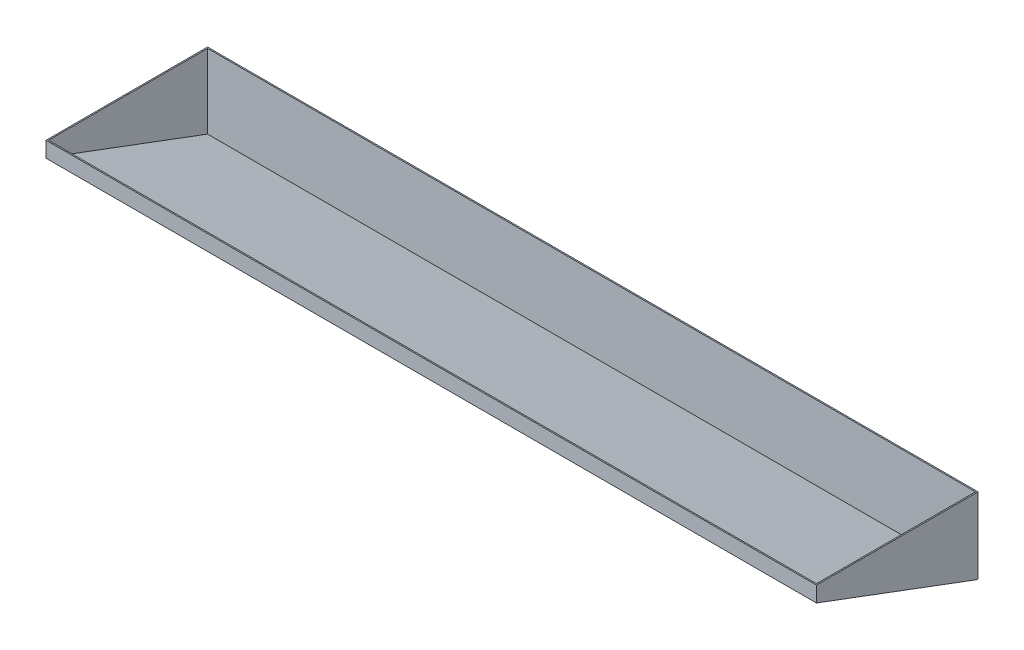
ISO-10303-21;
HEADER;
FILE_DESCRIPTION(('STEP AP214'),'2;1');
FILE_NAME('part.step','',(''),(''),'','','');
FILE_SCHEMA(('AUTOMOTIVE_DESIGN { 1 0 10303 214 1 1 1 1 }'));
ENDSEC;
DATA;
#1=APPLICATION_CONTEXT('core data for automotive mechanical design processes');
#2=APPLICATION_PROTOCOL_DEFINITION('international standard','automotive_design',2000,#1);
#3=PRODUCT_CONTEXT('',#1,'mechanical');
#4=PRODUCT('Part','Part','',(#3));
#5=PRODUCT_RELATED_PRODUCT_CATEGORY('part','',(#4));
#6=PRODUCT_DEFINITION_FORMATION('','',#4);
#7=PRODUCT_DEFINITION_CONTEXT('part definition',#1,'design');
#8=PRODUCT_DEFINITION('design','',#6,#7);
#9=PRODUCT_DEFINITION_SHAPE('','',#8);
#10=(LENGTH_UNIT() NAMED_UNIT(*) SI_UNIT(.MILLI.,.METRE.));
#11=(NAMED_UNIT(*) PLANE_ANGLE_UNIT() SI_UNIT($,.RADIAN.));
#12=(NAMED_UNIT(*) SI_UNIT($,.STERADIAN.) SOLID_ANGLE_UNIT());
#13=UNCERTAINTY_MEASURE_WITH_UNIT(LENGTH_MEASURE(1.E-05),#10,'distance_accuracy_value','');
#14=(GEOMETRIC_REPRESENTATION_CONTEXT(3) GLOBAL_UNCERTAINTY_ASSIGNED_CONTEXT((#13)) GLOBAL_UNIT_ASSIGNED_CONTEXT((#10,
#11,#12)) REPRESENTATION_CONTEXT('',''));
#15=CARTESIAN_POINT('',(0.,0.,0.));
#16=DIRECTION('',(0.,0.,1.));
#17=DIRECTION('',(1.,0.,0.));
#18=AXIS2_PLACEMENT_3D('',#15,#16,#17);
#19=CARTESIAN_POINT('',(0.,50.,0.8));
#20=DIRECTION('',(0.,-1.,0.));
#21=DIRECTION('',(0.,0.,-1.));
#22=AXIS2_PLACEMENT_3D('',#19,#20,#21);
#23=PLANE('',#22);
#24=DIRECTION('',(-1.,0.,0.));
#25=VECTOR('',#24,1.);
#26=CARTESIAN_POINT('',(0.,50.,0.));
#27=LINE('',#26,#25);
#28=CARTESIAN_POINT('',(510.,50.,0.));
#29=VERTEX_POINT('',#28);
#30=CARTESIAN_POINT('',(0.,50.,0.));
#31=VERTEX_POINT('',#30);
#32=EDGE_CURVE('E77',#29,#31,#27,.T.);
#33=ORIENTED_EDGE('',*,*,#32,.T.);
#34=DIRECTION('',(0.,0.,-1.));
#35=VECTOR('',#34,1.);
#36=CARTESIAN_POINT('',(0.,50.,0.8));
#37=LINE('',#36,#35);
#38=CARTESIAN_POINT('',(0.,50.,106.948846412905));
#39=VERTEX_POINT('',#38);
#40=EDGE_CURVE('E82',#39,#31,#37,.T.);
#41=ORIENTED_EDGE('',*,*,#40,.F.);
#42=DIRECTION('',(-1.,0.,0.));
#43=VECTOR('',#42,1.);
#44=CARTESIAN_POINT('',(510.,50.,106.948846412905));
#45=LINE('',#44,#43);
#46=CARTESIAN_POINT('',(510.,50.,106.948846412905));
#47=VERTEX_POINT('',#46);
#48=EDGE_CURVE('E103',#47,#39,#45,.T.);
#49=ORIENTED_EDGE('',*,*,#48,.F.);
#50=DIRECTION('',(0.,0.,-1.));
#51=VECTOR('',#50,1.);
#52=CARTESIAN_POINT('',(510.,50.,0.8));
#53=LINE('',#52,#51);
#54=EDGE_CURVE('E85',#47,#29,#53,.T.);
#55=ORIENTED_EDGE('',*,*,#54,.T.);
#56=EDGE_LOOP('',(#33,#41,#49,#55));
#57=FACE_BOUND('',#56,.T.);
#58=DIRECTION('',(-1.,0.,0.));
#59=VECTOR('',#58,1.);
#60=CARTESIAN_POINT('',(0.,50.,0.8));
#61=LINE('',#60,#59);
#62=CARTESIAN_POINT('',(509.2,50.,0.8));
#63=VERTEX_POINT('',#62);
#64=CARTESIAN_POINT('',(0.8,50.,0.8));
#65=VERTEX_POINT('',#64);
#66=EDGE_CURVE('E201',#63,#65,#61,.T.);
#67=ORIENTED_EDGE('',*,*,#66,.F.);
#68=DIRECTION('',(0.,0.,-1.));
#69=VECTOR('',#68,1.);
#70=CARTESIAN_POINT('',(509.2,50.,0.8));
#71=LINE('',#70,#69);
#72=CARTESIAN_POINT('',(509.2,50.,106.148846412905));
#73=VERTEX_POINT('',#72);
#74=EDGE_CURVE('E202',#73,#63,#71,.T.);
#75=ORIENTED_EDGE('',*,*,#74,.F.);
#76=DIRECTION('',(-1.,0.,0.));
#77=VECTOR('',#76,1.);
#78=CARTESIAN_POINT('',(0.,50.,106.148846412905));
#79=LINE('',#78,#77);
#80=CARTESIAN_POINT('',(0.8,50.,106.148846412905));
#81=VERTEX_POINT('',#80);
#82=EDGE_CURVE('E196',#73,#81,#79,.T.);
#83=ORIENTED_EDGE('',*,*,#82,.T.);
#84=DIRECTION('',(0.,0.,-1.));
#85=VECTOR('',#84,1.);
#86=CARTESIAN_POINT('',(0.8,50.,0.8));
#87=LINE('',#86,#85);
#88=EDGE_CURVE('E186',#81,#65,#87,.T.);
#89=ORIENTED_EDGE('',*,*,#88,.T.);
#90=EDGE_LOOP('',(#67,#75,#83,#89));
#91=FACE_BOUND('',#90,.T.);
#92=ADVANCED_FACE('F35',(#57,#91),#23,.F.);
#93=CARTESIAN_POINT('',(0.,0.,0.8));
#94=DIRECTION('',(1.,0.,0.));
#95=DIRECTION('',(0.,0.,-1.));
#96=AXIS2_PLACEMENT_3D('',#93,#94,#95);
#97=PLANE('',#96);
#98=DIRECTION('',(0.,-1.,0.));
#99=VECTOR('',#98,1.);
#100=CARTESIAN_POINT('',(0.,0.,0.));
#101=LINE('',#100,#99);
#102=CARTESIAN_POINT('',(0.,0.,0.));
#103=VERTEX_POINT('',#102);
#104=EDGE_CURVE('E96',#31,#103,#101,.T.);
#105=ORIENTED_EDGE('',*,*,#104,.T.);
#106=DIRECTION('',(0.,0.,-1.));
#107=VECTOR('',#106,1.);
#108=CARTESIAN_POINT('',(0.,0.,0.8));
#109=LINE('',#108,#107);
#110=CARTESIAN_POINT('',(0.,0.,0.8));
#111=VERTEX_POINT('',#110);
#112=EDGE_CURVE('E11',#111,#103,#109,.T.);
#113=ORIENTED_EDGE('',*,*,#112,.F.);
#114=DIRECTION('',(0.,0.350424137974276,0.936591118645156));
#115=VECTOR('',#114,1.);
#116=CARTESIAN_POINT('',(0.,0.,0.8));
#117=LINE('',#116,#115);
#118=CARTESIAN_POINT('',(0.,39.7154289216561,106.948846412905));
#119=VERTEX_POINT('',#118);
#120=EDGE_CURVE('E125',#111,#119,#117,.T.);
#121=ORIENTED_EDGE('',*,*,#120,.T.);
#122=DIRECTION('',(0.,1.,0.));
#123=VECTOR('',#122,1.);
#124=CARTESIAN_POINT('',(0.,39.7154289216561,106.948846412905));
#125=LINE('',#124,#123);
#126=EDGE_CURVE('E99',#119,#39,#125,.T.);
#127=ORIENTED_EDGE('',*,*,#126,.T.);
#128=ORIENTED_EDGE('',*,*,#40,.T.);
#129=EDGE_LOOP('',(#105,#113,#121,#127,#128));
#130=FACE_BOUND('',#129,.T.);
#131=ADVANCED_FACE('F37',(#130),#97,.F.);
#132=CARTESIAN_POINT('',(0.,0.,0.8));
#133=DIRECTION('',(0.,1.,0.));
#134=DIRECTION('',(0.,0.,1.));
#135=AXIS2_PLACEMENT_3D('',#132,#133,#134);
#136=PLANE('',#135);
#137=DIRECTION('',(1.,0.,0.));
#138=VECTOR('',#137,1.);
#139=CARTESIAN_POINT('',(0.,0.,0.));
#140=LINE('',#139,#138);
#141=CARTESIAN_POINT('',(510.,0.,0.));
#142=VERTEX_POINT('',#141);
#143=EDGE_CURVE('E102',#103,#142,#140,.T.);
#144=ORIENTED_EDGE('',*,*,#143,.T.);
#145=DIRECTION('',(0.,0.,-1.));
#146=VECTOR('',#145,1.);
#147=CARTESIAN_POINT('',(510.,0.,0.8));
#148=LINE('',#147,#146);
#149=CARTESIAN_POINT('',(510.,0.,0.8));
#150=VERTEX_POINT('',#149);
#151=EDGE_CURVE('E43',#150,#142,#148,.T.);
#152=ORIENTED_EDGE('',*,*,#151,.F.);
#153=DIRECTION('',(1.,0.,0.));
#154=VECTOR('',#153,1.);
#155=CARTESIAN_POINT('',(0.,0.,0.8));
#156=LINE('',#155,#154);
#157=EDGE_CURVE('E89',#111,#150,#156,.T.);
#158=ORIENTED_EDGE('',*,*,#157,.F.);
#159=ORIENTED_EDGE('',*,*,#112,.T.);
#160=EDGE_LOOP('',(#144,#152,#158,#159));
#161=FACE_BOUND('',#160,.T.);
#162=ADVANCED_FACE('F139',(#161),#136,.F.);
#163=CARTESIAN_POINT('',(510.,0.,0.8));
#164=DIRECTION('',(-1.,0.,0.));
#165=DIRECTION('',(0.,0.,1.));
#166=AXIS2_PLACEMENT_3D('',#163,#164,#165);
#167=PLANE('',#166);
#168=DIRECTION('',(0.,1.,0.));
#169=VECTOR('',#168,1.);
#170=CARTESIAN_POINT('',(510.,0.,0.));
#171=LINE('',#170,#169);
#172=EDGE_CURVE('E90',#142,#29,#171,.T.);
#173=ORIENTED_EDGE('',*,*,#172,.T.);
#174=ORIENTED_EDGE('',*,*,#54,.F.);
#175=DIRECTION('',(0.,1.,0.));
#176=VECTOR('',#175,1.);
#177=CARTESIAN_POINT('',(510.,39.7154289216561,106.948846412905));
#178=LINE('',#177,#176);
#179=CARTESIAN_POINT('',(510.,39.7154289216561,106.948846412905));
#180=VERTEX_POINT('',#179);
#181=EDGE_CURVE('E120',#180,#47,#178,.T.);
#182=ORIENTED_EDGE('',*,*,#181,.F.);
#183=DIRECTION('',(0.,0.350424137974276,0.936591118645156));
#184=VECTOR('',#183,1.);
#185=CARTESIAN_POINT('',(510.,0.,0.8));
#186=LINE('',#185,#184);
#187=EDGE_CURVE('E117',#150,#180,#186,.T.);
#188=ORIENTED_EDGE('',*,*,#187,.F.);
#189=ORIENTED_EDGE('',*,*,#151,.T.);
#190=EDGE_LOOP('',(#173,#174,#182,#188,#189));
#191=FACE_BOUND('',#190,.T.);
#192=ADVANCED_FACE('F114',(#191),#167,.F.);
#193=CARTESIAN_POINT('',(0.,0.,0.));
#194=DIRECTION('',(0.,0.,-1.));
#195=DIRECTION('',(-1.,0.,0.));
#196=AXIS2_PLACEMENT_3D('',#193,#194,#195);
#197=PLANE('',#196);
#198=ORIENTED_EDGE('',*,*,#104,.F.);
#199=ORIENTED_EDGE('',*,*,#32,.F.);
#200=ORIENTED_EDGE('',*,*,#172,.F.);
#201=ORIENTED_EDGE('',*,*,#143,.F.);
#202=EDGE_LOOP('',(#198,#199,#200,#201));
#203=FACE_BOUND('',#202,.T.);
#204=ADVANCED_FACE('F101',(#203),#197,.T.);
#205=CARTESIAN_POINT('',(510.,39.7154289216561,106.948846412905));
#206=DIRECTION('',(0.,0.,1.));
#207=DIRECTION('',(1.,0.,0.));
#208=AXIS2_PLACEMENT_3D('',#205,#206,#207);
#209=PLANE('',#208);
#210=ORIENTED_EDGE('',*,*,#126,.F.);
#211=DIRECTION('',(-1.,0.,0.));
#212=VECTOR('',#211,1.);
#213=CARTESIAN_POINT('',(510.,39.7154289216561,106.948846412905));
#214=LINE('',#213,#212);
#215=EDGE_CURVE('E106',#180,#119,#214,.T.);
#216=ORIENTED_EDGE('',*,*,#215,.F.);
#217=ORIENTED_EDGE('',*,*,#181,.T.);
#218=ORIENTED_EDGE('',*,*,#48,.T.);
#219=EDGE_LOOP('',(#210,#216,#217,#218));
#220=FACE_BOUND('',#219,.T.);
#221=ADVANCED_FACE('F138',(#220),#209,.T.);
#222=CARTESIAN_POINT('',(510.,0.,0.8));
#223=DIRECTION('',(0.,-0.936591118645156,0.350424137974276));
#224=DIRECTION('',(0.,-0.350424137974276,-0.936591118645156));
#225=AXIS2_PLACEMENT_3D('',#222,#223,#224);
#226=PLANE('',#225);
#227=ORIENTED_EDGE('',*,*,#120,.F.);
#228=ORIENTED_EDGE('',*,*,#157,.T.);
#229=ORIENTED_EDGE('',*,*,#187,.T.);
#230=ORIENTED_EDGE('',*,*,#215,.T.);
#231=EDGE_LOOP('',(#227,#228,#229,#230));
#232=FACE_BOUND('',#231,.T.);
#233=ADVANCED_FACE('F134',(#232),#226,.T.);
#234=CARTESIAN_POINT('',(0.8,0.,0.8));
#235=DIRECTION('',(1.,0.,0.));
#236=DIRECTION('',(0.,0.,-1.));
#237=AXIS2_PLACEMENT_3D('',#234,#235,#236);
#238=PLANE('',#237);
#239=DIRECTION('',(0.,-1.,0.));
#240=VECTOR('',#239,1.);
#241=CARTESIAN_POINT('',(0.8,0.,0.8));
#242=LINE('',#241,#240);
#243=CARTESIAN_POINT('',(0.800000000000011,0.854161420148053,0.8));
#244=VERTEX_POINT('',#243);
#245=EDGE_CURVE('E182',#65,#244,#242,.T.);
#246=ORIENTED_EDGE('',*,*,#245,.F.);
#247=ORIENTED_EDGE('',*,*,#88,.F.);
#248=DIRECTION('',(0.,1.,0.));
#249=VECTOR('',#248,1.);
#250=CARTESIAN_POINT('',(0.800000000000023,39.7154289216561,106.148846412905));
#251=LINE('',#250,#249);
#252=CARTESIAN_POINT('',(0.8,40.2702715624579,106.148846412905));
#253=VERTEX_POINT('',#252);
#254=EDGE_CURVE('E214',#253,#81,#251,.T.);
#255=ORIENTED_EDGE('',*,*,#254,.F.);
#256=DIRECTION('',(0.,0.350424137974276,0.936591118645156));
#257=VECTOR('',#256,1.);
#258=CARTESIAN_POINT('',(0.800000000000023,0.749272894916125,0.519660689620579));
#259=LINE('',#258,#257);
#260=EDGE_CURVE('E190',#244,#253,#259,.T.);
#261=ORIENTED_EDGE('',*,*,#260,.F.);
#262=EDGE_LOOP('',(#246,#247,#255,#261));
#263=FACE_BOUND('',#262,.T.);
#264=ADVANCED_FACE('F155',(#263),#238,.T.);
#265=CARTESIAN_POINT('',(509.2,0.,0.8));
#266=DIRECTION('',(-1.,0.,0.));
#267=DIRECTION('',(0.,0.,1.));
#268=AXIS2_PLACEMENT_3D('',#265,#266,#267);
#269=PLANE('',#268);
#270=DIRECTION('',(0.,0.350424137974276,0.936591118645156));
#271=VECTOR('',#270,1.);
#272=CARTESIAN_POINT('',(509.2,0.749272894916125,0.519660689620579));
#273=LINE('',#272,#271);
#274=CARTESIAN_POINT('',(509.2,0.854161420148053,0.8));
#275=VERTEX_POINT('',#274);
#276=CARTESIAN_POINT('',(509.2,40.2702715624579,106.148846412905));
#277=VERTEX_POINT('',#276);
#278=EDGE_CURVE('E212',#275,#277,#273,.T.);
#279=ORIENTED_EDGE('',*,*,#278,.T.);
#280=DIRECTION('',(0.,1.,0.));
#281=VECTOR('',#280,1.);
#282=CARTESIAN_POINT('',(509.2,0.,106.148846412905));
#283=LINE('',#282,#281);
#284=EDGE_CURVE('E50',#277,#73,#283,.T.);
#285=ORIENTED_EDGE('',*,*,#284,.T.);
#286=ORIENTED_EDGE('',*,*,#74,.T.);
#287=DIRECTION('',(0.,1.,0.));
#288=VECTOR('',#287,1.);
#289=CARTESIAN_POINT('',(509.2,0.,0.8));
#290=LINE('',#289,#288);
#291=EDGE_CURVE('E195',#275,#63,#290,.T.);
#292=ORIENTED_EDGE('',*,*,#291,.F.);
#293=EDGE_LOOP('',(#279,#285,#286,#292));
#294=FACE_BOUND('',#293,.T.);
#295=ADVANCED_FACE('F169',(#294),#269,.T.);
#296=CARTESIAN_POINT('',(0.,0.,0.8));
#297=DIRECTION('',(0.,0.,-1.));
#298=DIRECTION('',(-1.,0.,0.));
#299=AXIS2_PLACEMENT_3D('',#296,#297,#298);
#300=PLANE('',#299);
#301=ORIENTED_EDGE('',*,*,#291,.T.);
#302=ORIENTED_EDGE('',*,*,#66,.T.);
#303=ORIENTED_EDGE('',*,*,#245,.T.);
#304=DIRECTION('',(-1.,0.,0.));
#305=VECTOR('',#304,1.);
#306=CARTESIAN_POINT('',(0.,0.854161420148053,0.8));
#307=LINE('',#306,#305);
#308=EDGE_CURVE('E128',#275,#244,#307,.T.);
#309=ORIENTED_EDGE('',*,*,#308,.F.);
#310=EDGE_LOOP('',(#301,#302,#303,#309));
#311=FACE_BOUND('',#310,.T.);
#312=ADVANCED_FACE('F165',(#311),#300,.F.);
#313=CARTESIAN_POINT('',(510.,39.7154289216561,106.148846412905));
#314=DIRECTION('',(0.,0.,1.));
#315=DIRECTION('',(1.,0.,0.));
#316=AXIS2_PLACEMENT_3D('',#313,#314,#315);
#317=PLANE('',#316);
#318=ORIENTED_EDGE('',*,*,#254,.T.);
#319=ORIENTED_EDGE('',*,*,#82,.F.);
#320=ORIENTED_EDGE('',*,*,#284,.F.);
#321=DIRECTION('',(-1.,0.,0.));
#322=VECTOR('',#321,1.);
#323=CARTESIAN_POINT('',(510.,40.2702715624579,106.148846412905));
#324=LINE('',#323,#322);
#325=EDGE_CURVE('E207',#277,#253,#324,.T.);
#326=ORIENTED_EDGE('',*,*,#325,.T.);
#327=EDGE_LOOP('',(#318,#319,#320,#326));
#328=FACE_BOUND('',#327,.T.);
#329=ADVANCED_FACE('F161',(#328),#317,.F.);
#330=CARTESIAN_POINT('',(510.,0.749272894916125,0.519660689620579));
#331=DIRECTION('',(0.,-0.936591118645156,0.350424137974276));
#332=DIRECTION('',(0.,-0.350424137974276,-0.936591118645156));
#333=AXIS2_PLACEMENT_3D('',#330,#331,#332);
#334=PLANE('',#333);
#335=ORIENTED_EDGE('',*,*,#308,.T.);
#336=ORIENTED_EDGE('',*,*,#260,.T.);
#337=ORIENTED_EDGE('',*,*,#325,.F.);
#338=ORIENTED_EDGE('',*,*,#278,.F.);
#339=EDGE_LOOP('',(#335,#336,#337,#338));
#340=FACE_BOUND('',#339,.T.);
#341=ADVANCED_FACE('F158',(#340),#334,.F.);
#342=CLOSED_SHELL('',(#92,#131,#162,#192,#204,#221,#233,#264,#295,#312,#329,#341));
#343=MANIFOLD_SOLID_BREP('B2',#342);
#344=ADVANCED_BREP_SHAPE_REPRESENTATION('',(#18,#343),#14);
#345=SHAPE_DEFINITION_REPRESENTATION(#9,#344);
ENDSEC;
END-ISO-10303-21;
